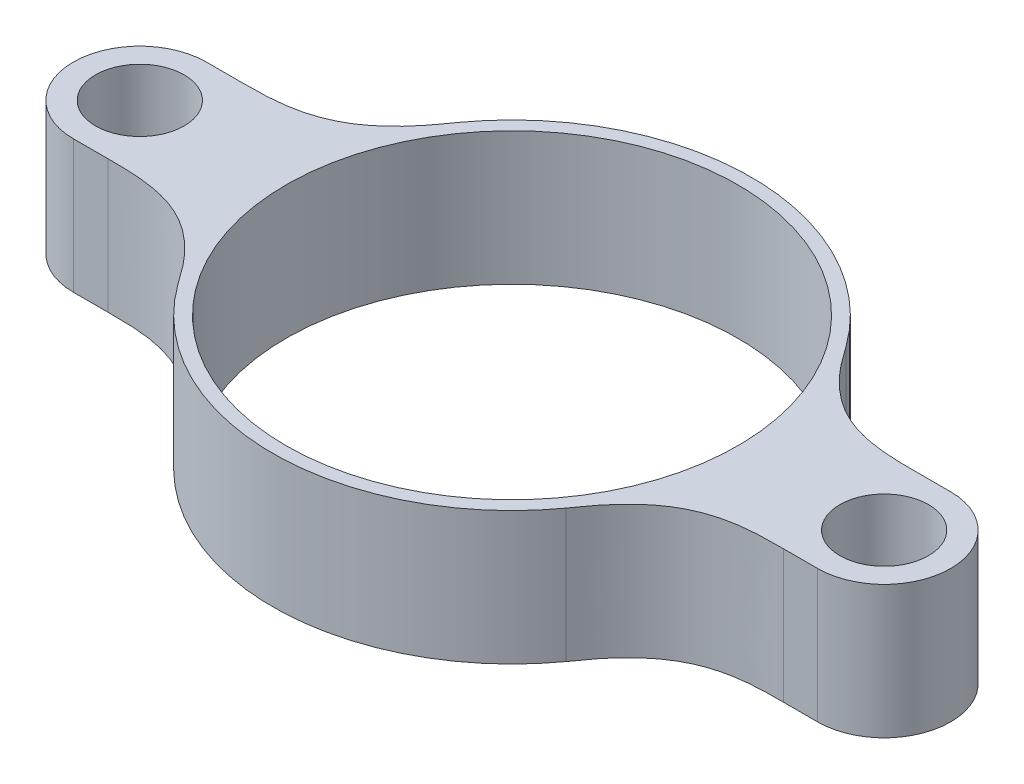
ISO-10303-21;
HEADER;
FILE_DESCRIPTION(('STEP AP214'),'2;1');
FILE_NAME('part.step','',(''),(''),'','','');
FILE_SCHEMA(('AUTOMOTIVE_DESIGN { 1 0 10303 214 1 1 1 1 }'));
ENDSEC;
DATA;
#1=APPLICATION_CONTEXT('core data for automotive mechanical design processes');
#2=APPLICATION_PROTOCOL_DEFINITION('international standard','automotive_design',2000,#1);
#3=PRODUCT_CONTEXT('',#1,'mechanical');
#4=PRODUCT('Part','Part','',(#3));
#5=PRODUCT_RELATED_PRODUCT_CATEGORY('part','',(#4));
#6=PRODUCT_DEFINITION_FORMATION('','',#4);
#7=PRODUCT_DEFINITION_CONTEXT('part definition',#1,'design');
#8=PRODUCT_DEFINITION('design','',#6,#7);
#9=PRODUCT_DEFINITION_SHAPE('','',#8);
#10=(LENGTH_UNIT() NAMED_UNIT(*) SI_UNIT(.MILLI.,.METRE.));
#11=(NAMED_UNIT(*) PLANE_ANGLE_UNIT() SI_UNIT($,.RADIAN.));
#12=(NAMED_UNIT(*) SI_UNIT($,.STERADIAN.) SOLID_ANGLE_UNIT());
#13=UNCERTAINTY_MEASURE_WITH_UNIT(LENGTH_MEASURE(1.E-05),#10,'distance_accuracy_value','');
#14=(GEOMETRIC_REPRESENTATION_CONTEXT(3) GLOBAL_UNCERTAINTY_ASSIGNED_CONTEXT((#13)) GLOBAL_UNIT_ASSIGNED_CONTEXT((#10,
#11,#12)) REPRESENTATION_CONTEXT('',''));
#15=CARTESIAN_POINT('',(0.,0.,0.));
#16=DIRECTION('',(0.,0.,1.));
#17=DIRECTION('',(1.,0.,0.));
#18=AXIS2_PLACEMENT_3D('',#15,#16,#17);
#19=CARTESIAN_POINT('',(-21.8958267602668,16.5,15.7978723404255));
#20=CARTESIAN_POINT('',(-21.8958267602633,10.4999999999935,15.7978723404305));
#21=CARTESIAN_POINT('',(-21.8958267602633,4.5,15.7978723404305));
#22=CARTESIAN_POINT('',(-21.8958267602668,-1.5,15.7978723404255));
#23=CARTESIAN_POINT('',(-22.718610484185,16.5,14.6574953648515));
#24=CARTESIAN_POINT('',(-22.7186104841642,10.4999999999935,14.6574953648619));
#25=CARTESIAN_POINT('',(-22.7186104841642,4.5,14.6574953648619));
#26=CARTESIAN_POINT('',(-22.718610484185,-1.5,14.6574953648515));
#27=CARTESIAN_POINT('',(-23.6231146998713,16.5,13.2473903830529));
#28=CARTESIAN_POINT('',(-23.6231146998296,10.4999999999935,13.2473903830685));
#29=CARTESIAN_POINT('',(-23.6231146998296,4.5,13.2473903830685));
#30=CARTESIAN_POINT('',(-23.6231146998713,-1.5,13.2473903830529));
#31=CARTESIAN_POINT('',(-26.7678170420405,16.5,9.57448341674504));
#32=CARTESIAN_POINT('',(-26.7678170420093,10.4999999999935,9.57448341675545));
#33=CARTESIAN_POINT('',(-26.7678170420093,4.5,9.57448341675545));
#34=CARTESIAN_POINT('',(-26.7678170420405,-1.5,9.57448341674504));
#35=CARTESIAN_POINT('',(-30.487182550474,16.5,7.89953716675253));
#36=CARTESIAN_POINT('',(-30.487182550474,10.4999999999935,7.89953716674212));
#37=CARTESIAN_POINT('',(-30.487182550474,4.5,7.89953716674212));
#38=CARTESIAN_POINT('',(-30.487182550474,-1.5,7.89953716675253));
#39=CARTESIAN_POINT('',(-34.4115464610609,16.5,7.5));
#40=CARTESIAN_POINT('',(-34.4115464611026,10.4999999999935,7.49999999998178));
#41=CARTESIAN_POINT('',(-34.4115464611026,4.5,7.49999999998178));
#42=CARTESIAN_POINT('',(-34.4115464610609,-1.5,7.5));
#43=CARTESIAN_POINT('',(-36.2632520774294,16.5,7.5));
#44=CARTESIAN_POINT('',(-36.2632520774502,10.4999999999935,7.49999999998959));
#45=CARTESIAN_POINT('',(-36.2632520774502,4.5,7.49999999998959));
#46=CARTESIAN_POINT('',(-36.2632520774294,-1.5,7.5));
#47=CARTESIAN_POINT('',(-38.1149576937978,16.5,7.5));
#48=CARTESIAN_POINT('',(-38.1149576937978,10.4999999999935,7.5));
#49=CARTESIAN_POINT('',(-38.1149576937978,4.5,7.5));
#50=CARTESIAN_POINT('',(-38.1149576937978,-1.5,7.5));
#51=B_SPLINE_SURFACE_WITH_KNOTS('',5,3,((#19,#20,#21,#22),(#23,#24,#25,#26),(#27,#28,#29,#30),
(#31,#32,#33,#34),(#35,#36,#37,#38),(#39,#40,#41,#42),(#43,#44,#45,#46),(#47,#48,#49,#50)),
.UNSPECIFIED.,.F.,.F.,.F.,(6,2,6),(4,4),(0.,0.5,1.),(-0.0015,0.0165),.UNSPECIFIED.);
#52=CARTESIAN_POINT('',(-21.8958267602668,-1.5,15.7978723404255));
#53=CARTESIAN_POINT('',(-21.8958267602633,4.5,15.7978723404305));
#54=CARTESIAN_POINT('',(-21.8958267602633,10.4999999999935,15.7978723404305));
#55=CARTESIAN_POINT('',(-21.8958267602668,16.5,15.7978723404255));
#56=B_SPLINE_CURVE_WITH_KNOTS('',3,(#52,#53,#54,#55),.UNSPECIFIED.,.F.,.F.,(4,4),(-0.0015,
0.0165),.UNSPECIFIED.);
#57=CARTESIAN_POINT('',(-21.895826760266,15.,15.7978723404267));
#58=VERTEX_POINT('',#57);
#59=CARTESIAN_POINT('',(-21.895826760266,0.,15.7978723404267));
#60=VERTEX_POINT('',#59);
#61=EDGE_CURVE('E538',#58,#60,#56,.F.);
#62=CARTESIAN_POINT('',(-21.895826760266,15.,15.7978723404267));
#63=CARTESIAN_POINT('',(-22.7186104841803,15.,14.6574953648539));
#64=CARTESIAN_POINT('',(-23.6231146998617,15.,13.2473903830565));
#65=CARTESIAN_POINT('',(-26.7678170420334,15.,9.57448341674742));
#66=CARTESIAN_POINT('',(-30.487182550474,15.,7.89953716675014));
#67=CARTESIAN_POINT('',(-34.4115464610705,15.,7.49999999999582));
#68=CARTESIAN_POINT('',(-36.2632520774342,15.,7.49999999999761));
#69=CARTESIAN_POINT('',(-38.1149576937978,15.,7.5));
#70=B_SPLINE_CURVE_WITH_KNOTS('',5,(#62,#63,#64,#65,#66,#67,#68,#69),.UNSPECIFIED.,.F.,.F.,(6,2,
6),(0.,0.5,1.),.UNSPECIFIED.);
#71=CARTESIAN_POINT('',(-38.1149576937979,15.,7.5));
#72=VERTEX_POINT('',#71);
#73=EDGE_CURVE('E55',#58,#72,#70,.T.);
#74=CARTESIAN_POINT('',(-38.1149576937978,16.5,7.5));
#75=CARTESIAN_POINT('',(-38.1149576937978,10.4999999999935,7.5));
#76=CARTESIAN_POINT('',(-38.1149576937978,4.5,7.5));
#77=CARTESIAN_POINT('',(-38.1149576937978,-1.5,7.5));
#78=B_SPLINE_CURVE_WITH_KNOTS('',3,(#74,#75,#76,#77),.UNSPECIFIED.,.F.,.F.,(4,4),(-0.0015,
0.0165),.UNSPECIFIED.);
#79=CARTESIAN_POINT('',(-38.1149576937978,0.,7.5));
#80=VERTEX_POINT('',#79);
#81=EDGE_CURVE('E541',#80,#72,#78,.F.);
#82=CARTESIAN_POINT('',(-38.1149576937978,0.,7.5));
#83=CARTESIAN_POINT('',(-36.2632520774342,0.,7.49999999999761));
#84=CARTESIAN_POINT('',(-34.4115464610705,0.,7.49999999999582));
#85=CARTESIAN_POINT('',(-30.487182550474,0.,7.89953716675014));
#86=CARTESIAN_POINT('',(-26.7678170420334,0.,9.57448341674742));
#87=CARTESIAN_POINT('',(-23.6231146998617,0.,13.2473903830565));
#88=CARTESIAN_POINT('',(-22.7186104841802,0.,14.6574953648539));
#89=CARTESIAN_POINT('',(-21.895826760266,0.,15.7978723404267));
#90=B_SPLINE_CURVE_WITH_KNOTS('',5,(#82,#83,#84,#85,#86,#87,#88,#89),.UNSPECIFIED.,.F.,.F.,(6,2,
6),(0.,0.5,1.),.UNSPECIFIED.);
#91=EDGE_CURVE('E12',#80,#60,#90,.T.);
#92=ORIENTED_EDGE('',*,*,#61,.F.);
#93=ORIENTED_EDGE('',*,*,#73,.T.);
#94=ORIENTED_EDGE('',*,*,#81,.F.);
#95=ORIENTED_EDGE('',*,*,#91,.T.);
#96=EDGE_LOOP('',(#92,#93,#94,#95));
#97=FACE_BOUND('',#96,.T.);
#98=ADVANCED_FACE('F41',(#97),#51,.T.);
#99=CARTESIAN_POINT('',(38.1149576937978,16.5,7.5));
#100=CARTESIAN_POINT('',(38.1149576937978,10.4999999999935,7.5));
#101=CARTESIAN_POINT('',(38.1149576937978,4.5,7.5));
#102=CARTESIAN_POINT('',(38.1149576937978,-1.5,7.5));
#103=CARTESIAN_POINT('',(36.2632520774294,16.5,7.5));
#104=CARTESIAN_POINT('',(36.2632520774918,10.4999999999935,7.49999999996878));
#105=CARTESIAN_POINT('',(36.2632520774918,4.5,7.49999999996878));
#106=CARTESIAN_POINT('',(36.2632520774294,-1.5,7.5));
#107=CARTESIAN_POINT('',(34.4115464610609,16.5,7.50000000000001));
#108=CARTESIAN_POINT('',(34.4115464611858,10.4999999999935,7.49999999994536));
#109=CARTESIAN_POINT('',(34.4115464611858,4.5,7.49999999994536));
#110=CARTESIAN_POINT('',(34.4115464610609,-1.5,7.50000000000001));
#111=CARTESIAN_POINT('',(30.487182550474,16.5,7.89953716675253));
#112=CARTESIAN_POINT('',(30.487182550474,10.4999999999935,7.89953716673692));
#113=CARTESIAN_POINT('',(30.487182550474,4.5,7.89953716673692));
#114=CARTESIAN_POINT('',(30.487182550474,-1.5,7.89953716675253));
#115=CARTESIAN_POINT('',(26.7678170420405,16.5,9.57448341674503));
#116=CARTESIAN_POINT('',(26.7678170419781,10.4999999999935,9.57448341676065));
#117=CARTESIAN_POINT('',(26.7678170419781,4.5,9.57448341676065));
#118=CARTESIAN_POINT('',(26.7678170420405,-1.5,9.57448341674503));
#119=CARTESIAN_POINT('',(23.6231146998713,16.5,13.2473903830529));
#120=CARTESIAN_POINT('',(23.6231146997776,10.4999999999935,13.2473903830997));
#121=CARTESIAN_POINT('',(23.6231146997776,4.5,13.2473903830997));
#122=CARTESIAN_POINT('',(23.6231146998713,-1.5,13.2473903830529));
#123=CARTESIAN_POINT('',(22.718610484185,16.5,14.6574953648515));
#124=CARTESIAN_POINT('',(22.7186104841226,10.4999999999935,14.6574953648827));
#125=CARTESIAN_POINT('',(22.7186104841226,4.5,14.6574953648827));
#126=CARTESIAN_POINT('',(22.718610484185,-1.5,14.6574953648515));
#127=CARTESIAN_POINT('',(21.8958267602669,16.5,15.7978723404255));
#128=CARTESIAN_POINT('',(21.8958267602562,10.4999999999935,15.7978723404403));
#129=CARTESIAN_POINT('',(21.8958267602562,4.5,15.7978723404403));
#130=CARTESIAN_POINT('',(21.8958267602669,-1.5,15.7978723404255));
#131=B_SPLINE_SURFACE_WITH_KNOTS('',5,3,((#99,#100,#101,#102),(#103,#104,#105,#106),(#107,#108,
#109,#110),(#111,#112,#113,#114),(#115,#116,#117,#118),(#119,#120,#121,#122),(#123,#124,#125,
#126),(#127,#128,#129,#130)),.UNSPECIFIED.,.F.,.F.,.F.,(6,2,6),(4,4),(0.,0.5,1.),(-0.0015,
0.0165),.UNSPECIFIED.);
#132=CARTESIAN_POINT('',(21.8958267602669,16.5,15.7978723404255));
#133=CARTESIAN_POINT('',(21.8958267602562,10.4999999999935,15.7978723404403));
#134=CARTESIAN_POINT('',(21.8958267602562,4.5,15.7978723404403));
#135=CARTESIAN_POINT('',(21.8958267602669,-1.5,15.7978723404255));
#136=B_SPLINE_CURVE_WITH_KNOTS('',3,(#132,#133,#134,#135),.UNSPECIFIED.,.F.,.F.,(4,4),(-0.0015,
0.0165),.UNSPECIFIED.);
#137=CARTESIAN_POINT('',(21.8958267602644,0.,15.7978723404289));
#138=VERTEX_POINT('',#137);
#139=CARTESIAN_POINT('',(21.8958267602644,15.,15.7978723404289));
#140=VERTEX_POINT('',#139);
#141=EDGE_CURVE('E228',#138,#140,#136,.F.);
#142=CARTESIAN_POINT('',(21.8958267602644,0.,15.7978723404289));
#143=CARTESIAN_POINT('',(22.7186104841707,0.,14.6574953648586));
#144=CARTESIAN_POINT('',(23.6231146998498,0.,13.2473903830636));
#145=CARTESIAN_POINT('',(26.7678170420262,0.,9.57448341674861));
#146=CARTESIAN_POINT('',(30.487182550474,0.,7.89953716674895));
#147=CARTESIAN_POINT('',(34.4115464610895,0.,7.49999999998748));
#148=CARTESIAN_POINT('',(36.2632520774437,0.,7.49999999999285));
#149=CARTESIAN_POINT('',(38.1149576937978,0.,7.5));
#150=B_SPLINE_CURVE_WITH_KNOTS('',5,(#142,#143,#144,#145,#146,#147,#148,#149),.UNSPECIFIED.,.F.,
.F.,(6,2,6),(0.,0.5,1.),.UNSPECIFIED.);
#151=CARTESIAN_POINT('',(38.1149576937978,0.,7.5));
#152=VERTEX_POINT('',#151);
#153=EDGE_CURVE('E838',#138,#152,#150,.T.);
#154=CARTESIAN_POINT('',(38.1149576937978,-1.5,7.5));
#155=CARTESIAN_POINT('',(38.1149576937978,4.5,7.5));
#156=CARTESIAN_POINT('',(38.1149576937978,10.4999999999935,7.5));
#157=CARTESIAN_POINT('',(38.1149576937978,16.5,7.5));
#158=B_SPLINE_CURVE_WITH_KNOTS('',3,(#154,#155,#156,#157),.UNSPECIFIED.,.F.,.F.,(4,4),(-0.0015,
0.0165),.UNSPECIFIED.);
#159=CARTESIAN_POINT('',(38.1149576937979,15.,7.5));
#160=VERTEX_POINT('',#159);
#161=EDGE_CURVE('E158',#160,#152,#158,.F.);
#162=CARTESIAN_POINT('',(38.1149576937978,15.,7.5));
#163=CARTESIAN_POINT('',(36.2632520774437,15.,7.49999999999285));
#164=CARTESIAN_POINT('',(34.4115464610895,15.,7.49999999998748));
#165=CARTESIAN_POINT('',(30.487182550474,15.,7.89953716674895));
#166=CARTESIAN_POINT('',(26.7678170420262,15.,9.57448341674861));
#167=CARTESIAN_POINT('',(23.6231146998498,15.,13.2473903830636));
#168=CARTESIAN_POINT('',(22.7186104841707,15.,14.6574953648586));
#169=CARTESIAN_POINT('',(21.8958267602644,15.,15.7978723404289));
#170=B_SPLINE_CURVE_WITH_KNOTS('',5,(#162,#163,#164,#165,#166,#167,#168,#169),.UNSPECIFIED.,.F.,
.F.,(6,2,6),(0.,0.5,1.),.UNSPECIFIED.);
#171=EDGE_CURVE('E339',#160,#140,#170,.T.);
#172=ORIENTED_EDGE('',*,*,#141,.F.);
#173=ORIENTED_EDGE('',*,*,#153,.T.);
#174=ORIENTED_EDGE('',*,*,#161,.F.);
#175=ORIENTED_EDGE('',*,*,#171,.T.);
#176=EDGE_LOOP('',(#172,#173,#174,#175));
#177=FACE_BOUND('',#176,.T.);
#178=ADVANCED_FACE('F234',(#177),#131,.T.);
#179=CARTESIAN_POINT('',(21.8958267602668,16.5,-15.7978723404255));
#180=CARTESIAN_POINT('',(21.8958267602633,10.4999999999935,-15.7978723404305));
#181=CARTESIAN_POINT('',(21.8958267602633,4.5,-15.7978723404305));
#182=CARTESIAN_POINT('',(21.8958267602668,-1.5,-15.7978723404255));
#183=CARTESIAN_POINT('',(22.718610484185,16.5,-14.6574953648515));
#184=CARTESIAN_POINT('',(22.7186104841642,10.4999999999935,-14.6574953648619));
#185=CARTESIAN_POINT('',(22.7186104841642,4.5,-14.6574953648619));
#186=CARTESIAN_POINT('',(22.718610484185,-1.5,-14.6574953648515));
#187=CARTESIAN_POINT('',(23.6231146998713,16.5,-13.2473903830529));
#188=CARTESIAN_POINT('',(23.62311469984,10.4999999999935,-13.2473903830685));
#189=CARTESIAN_POINT('',(23.62311469984,4.5,-13.2473903830685));
#190=CARTESIAN_POINT('',(23.6231146998713,-1.5,-13.2473903830529));
#191=CARTESIAN_POINT('',(26.7678170420405,16.5,-9.57448341674504));
#192=CARTESIAN_POINT('',(26.7678170420197,10.4999999999935,-9.57448341675024));
#193=CARTESIAN_POINT('',(26.7678170420197,4.5,-9.57448341675024));
#194=CARTESIAN_POINT('',(26.7678170420405,-1.5,-9.57448341674504));
#195=CARTESIAN_POINT('',(30.487182550474,16.5,-7.89953716675253));
#196=CARTESIAN_POINT('',(30.487182550474,10.4999999999935,-7.89953716674733));
#197=CARTESIAN_POINT('',(30.487182550474,4.5,-7.89953716674733));
#198=CARTESIAN_POINT('',(30.487182550474,-1.5,-7.89953716675253));
#199=CARTESIAN_POINT('',(34.4115464610609,16.5,-7.5));
#200=CARTESIAN_POINT('',(34.4115464611026,10.4999999999935,-7.49999999998178));
#201=CARTESIAN_POINT('',(34.4115464611026,4.5,-7.49999999998178));
#202=CARTESIAN_POINT('',(34.4115464610609,-1.5,-7.5));
#203=CARTESIAN_POINT('',(36.2632520774294,16.5,-7.5));
#204=CARTESIAN_POINT('',(36.2632520774502,10.4999999999935,-7.49999999998959));
#205=CARTESIAN_POINT('',(36.2632520774502,4.5,-7.49999999998959));
#206=CARTESIAN_POINT('',(36.2632520774294,-1.5,-7.5));
#207=CARTESIAN_POINT('',(38.1149576937978,16.5,-7.5));
#208=CARTESIAN_POINT('',(38.1149576937978,10.4999999999935,-7.5));
#209=CARTESIAN_POINT('',(38.1149576937978,4.5,-7.5));
#210=CARTESIAN_POINT('',(38.1149576937978,-1.5,-7.5));
#211=B_SPLINE_SURFACE_WITH_KNOTS('',5,3,((#179,#180,#181,#182),(#183,#184,#185,#186),(#187,#188,
#189,#190),(#191,#192,#193,#194),(#195,#196,#197,#198),(#199,#200,#201,#202),(#203,#204,#205,
#206),(#207,#208,#209,#210)),.UNSPECIFIED.,.F.,.F.,.F.,(6,2,6),(4,4),(0.,0.5,1.),(-0.0015,
0.0165),.UNSPECIFIED.);
#212=CARTESIAN_POINT('',(38.1149576937978,16.5,-7.5));
#213=CARTESIAN_POINT('',(38.1149576937978,10.4999999999935,-7.5));
#214=CARTESIAN_POINT('',(38.1149576937978,4.5,-7.5));
#215=CARTESIAN_POINT('',(38.1149576937978,-1.5,-7.5));
#216=B_SPLINE_CURVE_WITH_KNOTS('',3,(#212,#213,#214,#215),.UNSPECIFIED.,.F.,.F.,(4,4),(-0.0015,
0.0165),.UNSPECIFIED.);
#217=CARTESIAN_POINT('',(38.1149576937978,0.,-7.5));
#218=VERTEX_POINT('',#217);
#219=CARTESIAN_POINT('',(38.1149576937979,15.,-7.5));
#220=VERTEX_POINT('',#219);
#221=EDGE_CURVE('E187',#218,#220,#216,.F.);
#222=CARTESIAN_POINT('',(38.1149576937978,0.,-7.5));
#223=CARTESIAN_POINT('',(36.2632520774342,0.,-7.49999999999761));
#224=CARTESIAN_POINT('',(34.4115464610705,0.,-7.49999999999582));
#225=CARTESIAN_POINT('',(30.487182550474,0.,-7.89953716675134));
#226=CARTESIAN_POINT('',(26.7678170420358,0.,-9.57448341674623));
#227=CARTESIAN_POINT('',(23.6231146998641,0.,-13.2473903830565));
#228=CARTESIAN_POINT('',(22.7186104841802,0.,-14.6574953648539));
#229=CARTESIAN_POINT('',(21.895826760266,0.,-15.7978723404267));
#230=B_SPLINE_CURVE_WITH_KNOTS('',5,(#222,#223,#224,#225,#226,#227,#228,#229),.UNSPECIFIED.,.F.,
.F.,(6,2,6),(0.,0.5,1.),.UNSPECIFIED.);
#231=CARTESIAN_POINT('',(21.895826760266,0.,-15.7978723404267));
#232=VERTEX_POINT('',#231);
#233=EDGE_CURVE('E442',#218,#232,#230,.T.);
#234=CARTESIAN_POINT('',(21.8958267602668,-1.5,-15.7978723404255));
#235=CARTESIAN_POINT('',(21.8958267602633,4.5,-15.7978723404305));
#236=CARTESIAN_POINT('',(21.8958267602633,10.4999999999935,-15.7978723404305));
#237=CARTESIAN_POINT('',(21.8958267602668,16.5,-15.7978723404255));
#238=B_SPLINE_CURVE_WITH_KNOTS('',3,(#234,#235,#236,#237),.UNSPECIFIED.,.F.,.F.,(4,4),(-0.0015,
0.0165),.UNSPECIFIED.);
#239=CARTESIAN_POINT('',(21.895826760266,15.,-15.7978723404267));
#240=VERTEX_POINT('',#239);
#241=EDGE_CURVE('E431',#240,#232,#238,.F.);
#242=CARTESIAN_POINT('',(21.895826760266,15.,-15.7978723404267));
#243=CARTESIAN_POINT('',(22.7186104841803,15.,-14.6574953648539));
#244=CARTESIAN_POINT('',(23.6231146998641,15.,-13.2473903830565));
#245=CARTESIAN_POINT('',(26.7678170420358,15.,-9.57448341674623));
#246=CARTESIAN_POINT('',(30.487182550474,15.,-7.89953716675134));
#247=CARTESIAN_POINT('',(34.4115464610705,15.,-7.49999999999583));
#248=CARTESIAN_POINT('',(36.2632520774342,15.,-7.49999999999762));
#249=CARTESIAN_POINT('',(38.1149576937978,15.,-7.5));
#250=B_SPLINE_CURVE_WITH_KNOTS('',5,(#242,#243,#244,#245,#246,#247,#248,#249),.UNSPECIFIED.,.F.,
.F.,(6,2,6),(0.,0.5,1.),.UNSPECIFIED.);
#251=EDGE_CURVE('E461',#240,#220,#250,.T.);
#252=ORIENTED_EDGE('',*,*,#221,.F.);
#253=ORIENTED_EDGE('',*,*,#233,.T.);
#254=ORIENTED_EDGE('',*,*,#241,.F.);
#255=ORIENTED_EDGE('',*,*,#251,.T.);
#256=EDGE_LOOP('',(#252,#253,#254,#255));
#257=FACE_BOUND('',#256,.T.);
#258=ADVANCED_FACE('F248',(#257),#211,.T.);
#259=CARTESIAN_POINT('',(-38.1149576937978,16.5,-7.5));
#260=CARTESIAN_POINT('',(-38.1149576937978,10.4999999999935,-7.5));
#261=CARTESIAN_POINT('',(-38.1149576937978,4.5,-7.5));
#262=CARTESIAN_POINT('',(-38.1149576937978,-1.5,-7.5));
#263=CARTESIAN_POINT('',(-36.2632520774294,16.5,-7.5));
#264=CARTESIAN_POINT('',(-36.2632520774918,10.4999999999935,-7.49999999996878));
#265=CARTESIAN_POINT('',(-36.2632520774918,4.5,-7.49999999996878));
#266=CARTESIAN_POINT('',(-36.2632520774294,-1.5,-7.5));
#267=CARTESIAN_POINT('',(-34.4115464610609,16.5,-7.50000000000001));
#268=CARTESIAN_POINT('',(-34.4115464611858,10.4999999999935,-7.49999999994536));
#269=CARTESIAN_POINT('',(-34.4115464611858,4.5,-7.49999999994536));
#270=CARTESIAN_POINT('',(-34.4115464610609,-1.5,-7.50000000000001));
#271=CARTESIAN_POINT('',(-30.487182550474,16.5,-7.89953716675253));
#272=CARTESIAN_POINT('',(-30.487182550474,10.4999999999935,-7.8995371667213));
#273=CARTESIAN_POINT('',(-30.487182550474,4.5,-7.89953716672131));
#274=CARTESIAN_POINT('',(-30.487182550474,-1.5,-7.89953716675253));
#275=CARTESIAN_POINT('',(-26.7678170420405,16.5,-9.57448341674503));
#276=CARTESIAN_POINT('',(-26.7678170419469,10.4999999999935,-9.57448341677626));
#277=CARTESIAN_POINT('',(-26.7678170419469,4.5,-9.57448341677626));
#278=CARTESIAN_POINT('',(-26.7678170420405,-1.5,-9.57448341674503));
#279=CARTESIAN_POINT('',(-23.6231146998713,16.5,-13.2473903830529));
#280=CARTESIAN_POINT('',(-23.6231146997464,10.4999999999935,-13.2473903830997));
#281=CARTESIAN_POINT('',(-23.6231146997464,4.5,-13.2473903830997));
#282=CARTESIAN_POINT('',(-23.6231146998713,-1.5,-13.2473903830529));
#283=CARTESIAN_POINT('',(-22.718610484185,16.5,-14.6574953648515));
#284=CARTESIAN_POINT('',(-22.7186104841226,10.4999999999935,-14.6574953648827));
#285=CARTESIAN_POINT('',(-22.7186104841226,4.5,-14.6574953648827));
#286=CARTESIAN_POINT('',(-22.718610484185,-1.5,-14.6574953648515));
#287=CARTESIAN_POINT('',(-21.8958267602669,16.5,-15.7978723404255));
#288=CARTESIAN_POINT('',(-21.8958267602562,10.4999999999935,-15.7978723404403));
#289=CARTESIAN_POINT('',(-21.8958267602562,4.5,-15.7978723404403));
#290=CARTESIAN_POINT('',(-21.8958267602669,-1.5,-15.7978723404255));
#291=B_SPLINE_SURFACE_WITH_KNOTS('',5,3,((#259,#260,#261,#262),(#263,#264,#265,#266),(#267,#268,
#269,#270),(#271,#272,#273,#274),(#275,#276,#277,#278),(#279,#280,#281,#282),(#283,#284,#285,
#286),(#287,#288,#289,#290)),.UNSPECIFIED.,.F.,.F.,.F.,(6,2,6),(4,4),(0.,0.5,1.),(-0.0015,
0.0165),.UNSPECIFIED.);
#292=CARTESIAN_POINT('',(-38.1149576937978,-1.5,-7.5));
#293=CARTESIAN_POINT('',(-38.1149576937978,4.5,-7.5));
#294=CARTESIAN_POINT('',(-38.1149576937978,10.4999999999935,-7.5));
#295=CARTESIAN_POINT('',(-38.1149576937978,16.5,-7.5));
#296=B_SPLINE_CURVE_WITH_KNOTS('',3,(#292,#293,#294,#295),.UNSPECIFIED.,.F.,.F.,(4,4),(-0.0015,
0.0165),.UNSPECIFIED.);
#297=CARTESIAN_POINT('',(-38.1149576937979,15.,-7.5));
#298=VERTEX_POINT('',#297);
#299=CARTESIAN_POINT('',(-38.1149576937978,0.,-7.5));
#300=VERTEX_POINT('',#299);
#301=EDGE_CURVE('E480',#298,#300,#296,.F.);
#302=CARTESIAN_POINT('',(-38.1149576937978,15.,-7.5));
#303=CARTESIAN_POINT('',(-36.2632520774437,15.,-7.49999999999285));
#304=CARTESIAN_POINT('',(-34.4115464610895,15.,-7.49999999998748));
#305=CARTESIAN_POINT('',(-30.487182550474,15.,-7.89953716674538));
#306=CARTESIAN_POINT('',(-26.7678170420191,15.,-9.57448341675219));
#307=CARTESIAN_POINT('',(-23.6231146998427,15.,-13.2473903830636));
#308=CARTESIAN_POINT('',(-22.7186104841707,15.,-14.6574953648586));
#309=CARTESIAN_POINT('',(-21.8958267602644,15.,-15.7978723404289));
#310=B_SPLINE_CURVE_WITH_KNOTS('',5,(#302,#303,#304,#305,#306,#307,#308,#309),.UNSPECIFIED.,.F.,
.F.,(6,2,6),(0.,0.5,1.),.UNSPECIFIED.);
#311=CARTESIAN_POINT('',(-21.8958267602644,15.,-15.7978723404289));
#312=VERTEX_POINT('',#311);
#313=EDGE_CURVE('E470',#298,#312,#310,.T.);
#314=CARTESIAN_POINT('',(-21.8958267602669,16.5,-15.7978723404255));
#315=CARTESIAN_POINT('',(-21.8958267602562,10.4999999999935,-15.7978723404403));
#316=CARTESIAN_POINT('',(-21.8958267602562,4.5,-15.7978723404403));
#317=CARTESIAN_POINT('',(-21.8958267602669,-1.5,-15.7978723404255));
#318=B_SPLINE_CURVE_WITH_KNOTS('',3,(#314,#315,#316,#317),.UNSPECIFIED.,.F.,.F.,(4,4),(-0.0015,
0.0165),.UNSPECIFIED.);
#319=CARTESIAN_POINT('',(-21.8958267602644,0.,-15.7978723404289));
#320=VERTEX_POINT('',#319);
#321=EDGE_CURVE('E477',#320,#312,#318,.F.);
#322=CARTESIAN_POINT('',(-21.8958267602644,0.,-15.7978723404289));
#323=CARTESIAN_POINT('',(-22.7186104841707,0.,-14.6574953648586));
#324=CARTESIAN_POINT('',(-23.6231146998427,0.,-13.2473903830636));
#325=CARTESIAN_POINT('',(-26.7678170420191,0.,-9.57448341675219));
#326=CARTESIAN_POINT('',(-30.487182550474,0.,-7.89953716674538));
#327=CARTESIAN_POINT('',(-34.4115464610895,0.,-7.49999999998748));
#328=CARTESIAN_POINT('',(-36.2632520774437,0.,-7.49999999999285));
#329=CARTESIAN_POINT('',(-38.1149576937978,0.,-7.5));
#330=B_SPLINE_CURVE_WITH_KNOTS('',5,(#322,#323,#324,#325,#326,#327,#328,#329),.UNSPECIFIED.,.F.,
.F.,(6,2,6),(0.,0.5,1.),.UNSPECIFIED.);
#331=EDGE_CURVE('E469',#320,#300,#330,.T.);
#332=ORIENTED_EDGE('',*,*,#301,.F.);
#333=ORIENTED_EDGE('',*,*,#313,.T.);
#334=ORIENTED_EDGE('',*,*,#321,.F.);
#335=ORIENTED_EDGE('',*,*,#331,.T.);
#336=EDGE_LOOP('',(#332,#333,#334,#335));
#337=FACE_BOUND('',#336,.T.);
#338=ADVANCED_FACE('F395',(#337),#291,.T.);
#339=CARTESIAN_POINT('',(0.,15.,0.));
#340=DIRECTION('',(0.,-1.,0.));
#341=DIRECTION('',(0.,0.,-1.));
#342=AXIS2_PLACEMENT_3D('',#339,#340,#341);
#343=CYLINDRICAL_SURFACE('',#342,27.);
#344=CARTESIAN_POINT('',(0.,15.,0.));
#345=DIRECTION('',(0.,1.,0.));
#346=DIRECTION('',(0.,0.,1.));
#347=AXIS2_PLACEMENT_3D('',#344,#345,#346);
#348=CIRCLE('',#347,27.);
#349=EDGE_CURVE('E481',#58,#140,#348,.T.);
#350=ORIENTED_EDGE('',*,*,#349,.F.);
#351=ORIENTED_EDGE('',*,*,#61,.T.);
#352=CARTESIAN_POINT('',(0.,0.,0.));
#353=DIRECTION('',(0.,1.,0.));
#354=DIRECTION('',(0.,0.,1.));
#355=AXIS2_PLACEMENT_3D('',#352,#353,#354);
#356=CIRCLE('',#355,27.);
#357=EDGE_CURVE('E344',#60,#138,#356,.T.);
#358=ORIENTED_EDGE('',*,*,#357,.T.);
#359=ORIENTED_EDGE('',*,*,#141,.T.);
#360=EDGE_LOOP('',(#350,#351,#358,#359));
#361=FACE_BOUND('',#360,.T.);
#362=ADVANCED_FACE('F392',(#361),#343,.T.);
#363=EDGE_CURVE('E487',#240,#312,#348,.T.);
#364=ORIENTED_EDGE('',*,*,#363,.F.);
#365=ORIENTED_EDGE('',*,*,#241,.T.);
#366=EDGE_CURVE('E192',#232,#320,#356,.T.);
#367=ORIENTED_EDGE('',*,*,#366,.T.);
#368=ORIENTED_EDGE('',*,*,#321,.T.);
#369=EDGE_LOOP('',(#364,#365,#367,#368));
#370=FACE_BOUND('',#369,.T.);
#371=ADVANCED_FACE('F355',(#370),#343,.T.);
#372=CARTESIAN_POINT('',(0.,15.,0.));
#373=DIRECTION('',(0.,1.,0.));
#374=DIRECTION('',(0.,0.,1.));
#375=AXIS2_PLACEMENT_3D('',#372,#373,#374);
#376=PLANE('',#375);
#377=CARTESIAN_POINT('',(42.,15.,0.));
#378=DIRECTION('',(0.,1.,0.));
#379=DIRECTION('',(0.,0.,1.));
#380=AXIS2_PLACEMENT_3D('',#377,#378,#379);
#381=CIRCLE('',#380,5.);
#382=CARTESIAN_POINT('',(42.,15.,5.));
#383=VERTEX_POINT('',#382);
#384=EDGE_CURVE('E172',#383,#383,#381,.T.);
#385=ORIENTED_EDGE('',*,*,#384,.F.);
#386=EDGE_LOOP('',(#385));
#387=FACE_BOUND('',#386,.T.);
#388=CARTESIAN_POINT('',(-42.,15.,0.));
#389=DIRECTION('',(0.,1.,0.));
#390=DIRECTION('',(0.,0.,1.));
#391=AXIS2_PLACEMENT_3D('',#388,#389,#390);
#392=CIRCLE('',#391,5.);
#393=CARTESIAN_POINT('',(-42.,15.,5.));
#394=VERTEX_POINT('',#393);
#395=EDGE_CURVE('E611',#394,#394,#392,.T.);
#396=ORIENTED_EDGE('',*,*,#395,.F.);
#397=EDGE_LOOP('',(#396));
#398=FACE_BOUND('',#397,.T.);
#399=ORIENTED_EDGE('',*,*,#73,.F.);
#400=ORIENTED_EDGE('',*,*,#349,.T.);
#401=ORIENTED_EDGE('',*,*,#171,.F.);
#402=DIRECTION('',(-1.,0.,0.));
#403=VECTOR('',#402,1.);
#404=CARTESIAN_POINT('',(0.,15.,7.5));
#405=LINE('',#404,#403);
#406=CARTESIAN_POINT('',(42.,15.,7.5));
#407=VERTEX_POINT('',#406);
#408=EDGE_CURVE('E166',#407,#160,#405,.T.);
#409=ORIENTED_EDGE('',*,*,#408,.F.);
#410=CARTESIAN_POINT('',(42.,15.,0.));
#411=DIRECTION('',(0.,1.,0.));
#412=DIRECTION('',(0.,0.,1.));
#413=AXIS2_PLACEMENT_3D('',#410,#411,#412);
#414=CIRCLE('',#413,7.5);
#415=CARTESIAN_POINT('',(42.,15.,-7.5));
#416=VERTEX_POINT('',#415);
#417=EDGE_CURVE('E149',#416,#407,#414,.F.);
#418=ORIENTED_EDGE('',*,*,#417,.F.);
#419=DIRECTION('',(-1.,0.,0.));
#420=VECTOR('',#419,1.);
#421=CARTESIAN_POINT('',(0.,15.,-7.5));
#422=LINE('',#421,#420);
#423=EDGE_CURVE('E160',#416,#220,#422,.T.);
#424=ORIENTED_EDGE('',*,*,#423,.T.);
#425=ORIENTED_EDGE('',*,*,#251,.F.);
#426=ORIENTED_EDGE('',*,*,#363,.T.);
#427=ORIENTED_EDGE('',*,*,#313,.F.);
#428=DIRECTION('',(1.,0.,0.));
#429=VECTOR('',#428,1.);
#430=CARTESIAN_POINT('',(0.,15.,-7.5));
#431=LINE('',#430,#429);
#432=CARTESIAN_POINT('',(-42.,15.,-7.5));
#433=VERTEX_POINT('',#432);
#434=EDGE_CURVE('E498',#433,#298,#431,.T.);
#435=ORIENTED_EDGE('',*,*,#434,.F.);
#436=CARTESIAN_POINT('',(-42.,15.,0.));
#437=DIRECTION('',(0.,1.,0.));
#438=DIRECTION('',(0.,0.,1.));
#439=AXIS2_PLACEMENT_3D('',#436,#437,#438);
#440=CIRCLE('',#439,7.5);
#441=CARTESIAN_POINT('',(-42.,15.,7.5));
#442=VERTEX_POINT('',#441);
#443=EDGE_CURVE('E502',#433,#442,#440,.T.);
#444=ORIENTED_EDGE('',*,*,#443,.T.);
#445=DIRECTION('',(1.,0.,0.));
#446=VECTOR('',#445,1.);
#447=CARTESIAN_POINT('',(0.,15.,7.5));
#448=LINE('',#447,#446);
#449=EDGE_CURVE('E503',#442,#72,#448,.T.);
#450=ORIENTED_EDGE('',*,*,#449,.T.);
#451=EDGE_LOOP('',(#399,#400,#401,#409,#418,#424,#425,#426,#427,#435,#444,#450));
#452=FACE_BOUND('',#451,.T.);
#453=CARTESIAN_POINT('',(0.,15.,0.));
#454=DIRECTION('',(0.,1.,0.));
#455=DIRECTION('',(0.,0.,1.));
#456=AXIS2_PLACEMENT_3D('',#453,#454,#455);
#457=CIRCLE('',#456,25.5);
#458=CARTESIAN_POINT('',(0.,15.,25.5));
#459=VERTEX_POINT('',#458);
#460=EDGE_CURVE('E493',#459,#459,#457,.T.);
#461=ORIENTED_EDGE('',*,*,#460,.F.);
#462=EDGE_LOOP('',(#461));
#463=FACE_BOUND('',#462,.T.);
#464=ADVANCED_FACE('F346',(#387,#398,#452,#463),#376,.T.);
#465=CARTESIAN_POINT('',(0.,0.,0.));
#466=DIRECTION('',(0.,1.,0.));
#467=DIRECTION('',(0.,0.,1.));
#468=AXIS2_PLACEMENT_3D('',#465,#466,#467);
#469=PLANE('',#468);
#470=CARTESIAN_POINT('',(42.,0.,0.));
#471=DIRECTION('',(0.,-1.,0.));
#472=DIRECTION('',(0.,0.,-1.));
#473=AXIS2_PLACEMENT_3D('',#470,#471,#472);
#474=CIRCLE('',#473,5.);
#475=CARTESIAN_POINT('',(42.,0.,-5.));
#476=VERTEX_POINT('',#475);
#477=EDGE_CURVE('E615',#476,#476,#474,.T.);
#478=ORIENTED_EDGE('',*,*,#477,.F.);
#479=EDGE_LOOP('',(#478));
#480=FACE_BOUND('',#479,.T.);
#481=CARTESIAN_POINT('',(-42.,0.,0.));
#482=DIRECTION('',(0.,-1.,0.));
#483=DIRECTION('',(0.,0.,-1.));
#484=AXIS2_PLACEMENT_3D('',#481,#482,#483);
#485=CIRCLE('',#484,5.);
#486=CARTESIAN_POINT('',(-42.,0.,-5.));
#487=VERTEX_POINT('',#486);
#488=EDGE_CURVE('E619',#487,#487,#485,.T.);
#489=ORIENTED_EDGE('',*,*,#488,.F.);
#490=EDGE_LOOP('',(#489));
#491=FACE_BOUND('',#490,.T.);
#492=CARTESIAN_POINT('',(0.,0.,0.));
#493=DIRECTION('',(0.,1.,0.));
#494=DIRECTION('',(0.,0.,1.));
#495=AXIS2_PLACEMENT_3D('',#492,#493,#494);
#496=CIRCLE('',#495,25.5);
#497=CARTESIAN_POINT('',(0.,0.,25.5));
#498=VERTEX_POINT('',#497);
#499=EDGE_CURVE('E518',#498,#498,#496,.T.);
#500=ORIENTED_EDGE('',*,*,#499,.T.);
#501=EDGE_LOOP('',(#500));
#502=FACE_BOUND('',#501,.T.);
#503=ORIENTED_EDGE('',*,*,#357,.F.);
#504=ORIENTED_EDGE('',*,*,#91,.F.);
#505=DIRECTION('',(1.,0.,0.));
#506=VECTOR('',#505,1.);
#507=CARTESIAN_POINT('',(0.,0.,7.5));
#508=LINE('',#507,#506);
#509=CARTESIAN_POINT('',(-42.,0.,7.5));
#510=VERTEX_POINT('',#509);
#511=EDGE_CURVE('E513',#510,#80,#508,.T.);
#512=ORIENTED_EDGE('',*,*,#511,.F.);
#513=CARTESIAN_POINT('',(-42.,0.,0.));
#514=DIRECTION('',(0.,1.,0.));
#515=DIRECTION('',(0.,0.,1.));
#516=AXIS2_PLACEMENT_3D('',#513,#514,#515);
#517=CIRCLE('',#516,7.5);
#518=CARTESIAN_POINT('',(-42.,0.,-7.5));
#519=VERTEX_POINT('',#518);
#520=EDGE_CURVE('E517',#519,#510,#517,.T.);
#521=ORIENTED_EDGE('',*,*,#520,.F.);
#522=DIRECTION('',(1.,0.,0.));
#523=VECTOR('',#522,1.);
#524=CARTESIAN_POINT('',(0.,0.,-7.5));
#525=LINE('',#524,#523);
#526=EDGE_CURVE('E504',#519,#300,#525,.T.);
#527=ORIENTED_EDGE('',*,*,#526,.T.);
#528=ORIENTED_EDGE('',*,*,#331,.F.);
#529=ORIENTED_EDGE('',*,*,#366,.F.);
#530=ORIENTED_EDGE('',*,*,#233,.F.);
#531=DIRECTION('',(-1.,0.,0.));
#532=VECTOR('',#531,1.);
#533=CARTESIAN_POINT('',(0.,0.,-7.5));
#534=LINE('',#533,#532);
#535=CARTESIAN_POINT('',(42.,0.,-7.5));
#536=VERTEX_POINT('',#535);
#537=EDGE_CURVE('E142',#536,#218,#534,.T.);
#538=ORIENTED_EDGE('',*,*,#537,.F.);
#539=CARTESIAN_POINT('',(42.,0.,0.));
#540=DIRECTION('',(0.,1.,0.));
#541=DIRECTION('',(0.,0.,1.));
#542=AXIS2_PLACEMENT_3D('',#539,#540,#541);
#543=CIRCLE('',#542,7.5);
#544=CARTESIAN_POINT('',(42.,0.,7.5));
#545=VERTEX_POINT('',#544);
#546=EDGE_CURVE('E135',#536,#545,#543,.F.);
#547=ORIENTED_EDGE('',*,*,#546,.T.);
#548=DIRECTION('',(-1.,0.,0.));
#549=VECTOR('',#548,1.);
#550=CARTESIAN_POINT('',(0.,0.,7.5));
#551=LINE('',#550,#549);
#552=EDGE_CURVE('E140',#545,#152,#551,.T.);
#553=ORIENTED_EDGE('',*,*,#552,.T.);
#554=ORIENTED_EDGE('',*,*,#153,.F.);
#555=EDGE_LOOP('',(#503,#504,#512,#521,#527,#528,#529,#530,#538,#547,#553,#554));
#556=FACE_BOUND('',#555,.T.);
#557=ADVANCED_FACE('F137',(#480,#491,#502,#556),#469,.F.);
#558=CARTESIAN_POINT('',(0.,0.,0.));
#559=DIRECTION('',(0.,1.,0.));
#560=DIRECTION('',(0.,0.,1.));
#561=AXIS2_PLACEMENT_3D('',#558,#559,#560);
#562=CYLINDRICAL_SURFACE('',#561,25.5);
#563=ORIENTED_EDGE('',*,*,#499,.F.);
#564=EDGE_LOOP('',(#563));
#565=FACE_BOUND('',#564,.T.);
#566=ORIENTED_EDGE('',*,*,#460,.T.);
#567=EDGE_LOOP('',(#566));
#568=FACE_BOUND('',#567,.T.);
#569=ADVANCED_FACE('F357',(#565,#568),#562,.F.);
#570=CARTESIAN_POINT('',(0.,0.,7.5));
#571=DIRECTION('',(0.,0.,1.));
#572=DIRECTION('',(1.,0.,0.));
#573=AXIS2_PLACEMENT_3D('',#570,#571,#572);
#574=PLANE('',#573);
#575=ORIENTED_EDGE('',*,*,#511,.T.);
#576=ORIENTED_EDGE('',*,*,#81,.T.);
#577=ORIENTED_EDGE('',*,*,#449,.F.);
#578=DIRECTION('',(0.,1.,0.));
#579=VECTOR('',#578,1.);
#580=CARTESIAN_POINT('',(-42.,0.,7.5));
#581=LINE('',#580,#579);
#582=EDGE_CURVE('E514',#510,#442,#581,.T.);
#583=ORIENTED_EDGE('',*,*,#582,.F.);
#584=EDGE_LOOP('',(#575,#576,#577,#583));
#585=FACE_BOUND('',#584,.T.);
#586=ADVANCED_FACE('F527',(#585),#574,.T.);
#587=CARTESIAN_POINT('',(-42.,0.,0.));
#588=DIRECTION('',(0.,1.,0.));
#589=DIRECTION('',(0.,0.,1.));
#590=AXIS2_PLACEMENT_3D('',#587,#588,#589);
#591=CYLINDRICAL_SURFACE('',#590,7.5);
#592=ORIENTED_EDGE('',*,*,#443,.F.);
#593=DIRECTION('',(0.,1.,0.));
#594=VECTOR('',#593,1.);
#595=CARTESIAN_POINT('',(-42.,0.,-7.5));
#596=LINE('',#595,#594);
#597=EDGE_CURVE('E516',#519,#433,#596,.T.);
#598=ORIENTED_EDGE('',*,*,#597,.F.);
#599=ORIENTED_EDGE('',*,*,#520,.T.);
#600=ORIENTED_EDGE('',*,*,#582,.T.);
#601=EDGE_LOOP('',(#592,#598,#599,#600));
#602=FACE_BOUND('',#601,.T.);
#603=ADVANCED_FACE('F213',(#602),#591,.T.);
#604=CARTESIAN_POINT('',(0.,0.,-7.5));
#605=DIRECTION('',(0.,0.,1.));
#606=DIRECTION('',(1.,0.,0.));
#607=AXIS2_PLACEMENT_3D('',#604,#605,#606);
#608=PLANE('',#607);
#609=ORIENTED_EDGE('',*,*,#434,.T.);
#610=ORIENTED_EDGE('',*,*,#301,.T.);
#611=ORIENTED_EDGE('',*,*,#526,.F.);
#612=ORIENTED_EDGE('',*,*,#597,.T.);
#613=EDGE_LOOP('',(#609,#610,#611,#612));
#614=FACE_BOUND('',#613,.T.);
#615=ADVANCED_FACE('F205',(#614),#608,.F.);
#616=CARTESIAN_POINT('',(0.,0.,-7.5));
#617=DIRECTION('',(0.,0.,-1.));
#618=DIRECTION('',(-1.,0.,0.));
#619=AXIS2_PLACEMENT_3D('',#616,#617,#618);
#620=PLANE('',#619);
#621=ORIENTED_EDGE('',*,*,#537,.T.);
#622=ORIENTED_EDGE('',*,*,#221,.T.);
#623=ORIENTED_EDGE('',*,*,#423,.F.);
#624=DIRECTION('',(0.,1.,0.));
#625=VECTOR('',#624,1.);
#626=CARTESIAN_POINT('',(42.,0.,-7.5));
#627=LINE('',#626,#625);
#628=EDGE_CURVE('E153',#536,#416,#627,.T.);
#629=ORIENTED_EDGE('',*,*,#628,.F.);
#630=EDGE_LOOP('',(#621,#622,#623,#629));
#631=FACE_BOUND('',#630,.T.);
#632=ADVANCED_FACE('F195',(#631),#620,.T.);
#633=CARTESIAN_POINT('',(42.,0.,0.));
#634=DIRECTION('',(0.,1.,0.));
#635=DIRECTION('',(0.,0.,1.));
#636=AXIS2_PLACEMENT_3D('',#633,#634,#635);
#637=CYLINDRICAL_SURFACE('',#636,7.5);
#638=ORIENTED_EDGE('',*,*,#417,.T.);
#639=DIRECTION('',(0.,1.,0.));
#640=VECTOR('',#639,1.);
#641=CARTESIAN_POINT('',(42.,0.,7.5));
#642=LINE('',#641,#640);
#643=EDGE_CURVE('E146',#545,#407,#642,.T.);
#644=ORIENTED_EDGE('',*,*,#643,.F.);
#645=ORIENTED_EDGE('',*,*,#546,.F.);
#646=ORIENTED_EDGE('',*,*,#628,.T.);
#647=EDGE_LOOP('',(#638,#644,#645,#646));
#648=FACE_BOUND('',#647,.T.);
#649=ADVANCED_FACE('F147',(#648),#637,.T.);
#650=CARTESIAN_POINT('',(0.,0.,7.5));
#651=DIRECTION('',(0.,0.,-1.));
#652=DIRECTION('',(-1.,0.,0.));
#653=AXIS2_PLACEMENT_3D('',#650,#651,#652);
#654=PLANE('',#653);
#655=ORIENTED_EDGE('',*,*,#408,.T.);
#656=ORIENTED_EDGE('',*,*,#161,.T.);
#657=ORIENTED_EDGE('',*,*,#552,.F.);
#658=ORIENTED_EDGE('',*,*,#643,.T.);
#659=EDGE_LOOP('',(#655,#656,#657,#658));
#660=FACE_BOUND('',#659,.T.);
#661=ADVANCED_FACE('F156',(#660),#654,.F.);
#662=CARTESIAN_POINT('',(-42.,15.0100000000008,0.));
#663=DIRECTION('',(0.,-1.,0.));
#664=DIRECTION('',(0.,0.,-1.));
#665=AXIS2_PLACEMENT_3D('',#662,#663,#664);
#666=CYLINDRICAL_SURFACE('',#665,5.);
#667=ORIENTED_EDGE('',*,*,#395,.T.);
#668=EDGE_LOOP('',(#667));
#669=FACE_BOUND('',#668,.T.);
#670=ORIENTED_EDGE('',*,*,#488,.T.);
#671=EDGE_LOOP('',(#670));
#672=FACE_BOUND('',#671,.T.);
#673=ADVANCED_FACE('F206',(#669,#672),#666,.F.);
#674=CARTESIAN_POINT('',(42.,15.0100000000008,0.));
#675=DIRECTION('',(0.,-1.,0.));
#676=DIRECTION('',(0.,0.,-1.));
#677=AXIS2_PLACEMENT_3D('',#674,#675,#676);
#678=CYLINDRICAL_SURFACE('',#677,5.);
#679=ORIENTED_EDGE('',*,*,#384,.T.);
#680=EDGE_LOOP('',(#679));
#681=FACE_BOUND('',#680,.T.);
#682=ORIENTED_EDGE('',*,*,#477,.T.);
#683=EDGE_LOOP('',(#682));
#684=FACE_BOUND('',#683,.T.);
#685=ADVANCED_FACE('F627',(#681,#684),#678,.F.);
#686=CLOSED_SHELL('',(#98,#178,#258,#338,#362,#371,#464,#557,#569,#586,#603,#615,#632,#649,#661,
#673,#685));
#687=MANIFOLD_SOLID_BREP('B2',#686);
#688=ADVANCED_BREP_SHAPE_REPRESENTATION('',(#18,#687),#14);
#689=SHAPE_DEFINITION_REPRESENTATION(#9,#688);
ENDSEC;
END-ISO-10303-21;
